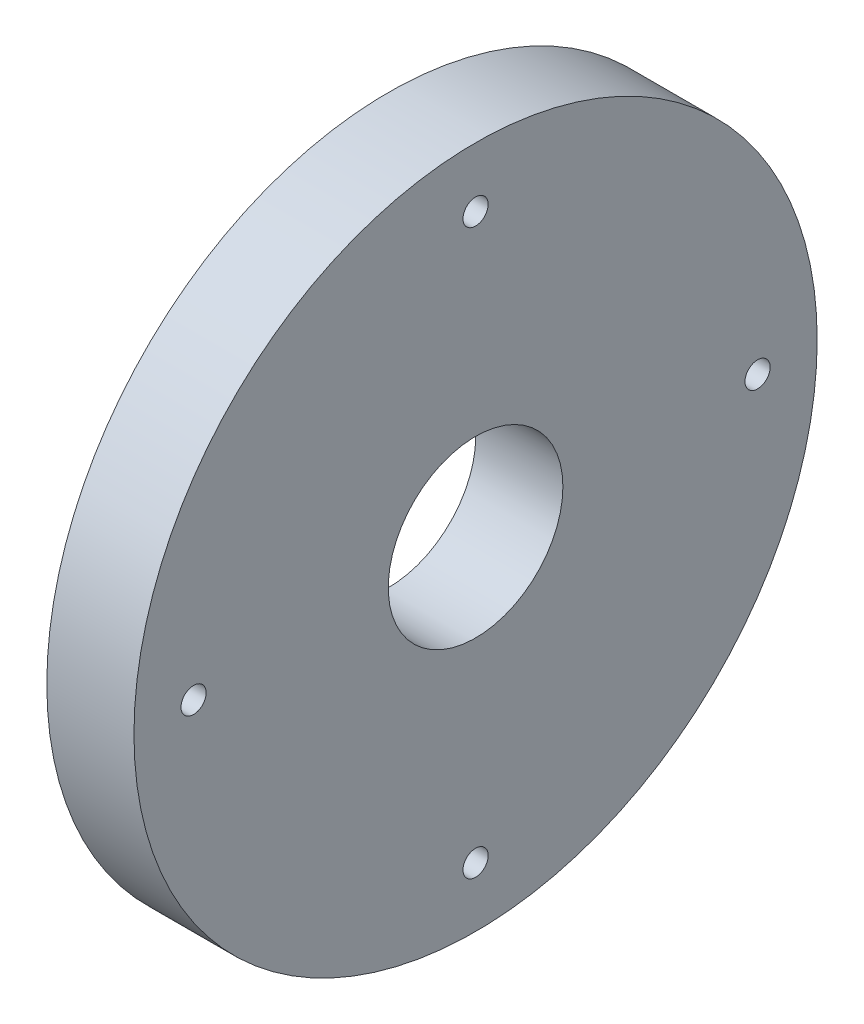
ISO-10303-21;
HEADER;
FILE_DESCRIPTION(('STEP AP214'),'2;1');
FILE_NAME('part.step','',(''),(''),'','','');
FILE_SCHEMA(('AUTOMOTIVE_DESIGN { 1 0 10303 214 1 1 1 1 }'));
ENDSEC;
DATA;
#1=APPLICATION_CONTEXT('core data for automotive mechanical design processes');
#2=APPLICATION_PROTOCOL_DEFINITION('international standard','automotive_design',2000,#1);
#3=PRODUCT_CONTEXT('',#1,'mechanical');
#4=PRODUCT('Part','Part','',(#3));
#5=PRODUCT_RELATED_PRODUCT_CATEGORY('part','',(#4));
#6=PRODUCT_DEFINITION_FORMATION('','',#4);
#7=PRODUCT_DEFINITION_CONTEXT('part definition',#1,'design');
#8=PRODUCT_DEFINITION('design','',#6,#7);
#9=PRODUCT_DEFINITION_SHAPE('','',#8);
#10=(LENGTH_UNIT() NAMED_UNIT(*) SI_UNIT(.MILLI.,.METRE.));
#11=(NAMED_UNIT(*) PLANE_ANGLE_UNIT() SI_UNIT($,.RADIAN.));
#12=(NAMED_UNIT(*) SI_UNIT($,.STERADIAN.) SOLID_ANGLE_UNIT());
#13=UNCERTAINTY_MEASURE_WITH_UNIT(LENGTH_MEASURE(1.E-05),#10,'distance_accuracy_value','');
#14=(GEOMETRIC_REPRESENTATION_CONTEXT(3) GLOBAL_UNCERTAINTY_ASSIGNED_CONTEXT((#13)) GLOBAL_UNIT_ASSIGNED_CONTEXT((#10,
#11,#12)) REPRESENTATION_CONTEXT('',''));
#15=CARTESIAN_POINT('',(0.,0.,0.));
#16=DIRECTION('',(0.,0.,1.));
#17=DIRECTION('',(1.,0.,0.));
#18=AXIS2_PLACEMENT_3D('',#15,#16,#17);
#19=CARTESIAN_POINT('',(-3.175,0.,0.));
#20=DIRECTION('',(1.,0.,0.));
#21=DIRECTION('',(0.,0.,-1.));
#22=AXIS2_PLACEMENT_3D('',#19,#20,#21);
#23=CYLINDRICAL_SURFACE('',#22,24.892);
#24=CARTESIAN_POINT('',(-3.175,0.,0.));
#25=DIRECTION('',(1.,0.,0.));
#26=DIRECTION('',(0.,0.,-1.));
#27=AXIS2_PLACEMENT_3D('',#24,#25,#26);
#28=CIRCLE('',#27,24.892);
#29=CARTESIAN_POINT('',(-3.175,0.,-24.892));
#30=VERTEX_POINT('',#29);
#31=EDGE_CURVE('E10',#30,#30,#28,.T.);
#32=ORIENTED_EDGE('',*,*,#31,.T.);
#33=EDGE_LOOP('',(#32));
#34=FACE_BOUND('',#33,.T.);
#35=CARTESIAN_POINT('',(3.175,0.,0.));
#36=DIRECTION('',(1.,0.,0.));
#37=DIRECTION('',(0.,0.,-1.));
#38=AXIS2_PLACEMENT_3D('',#35,#36,#37);
#39=CIRCLE('',#38,24.892);
#40=CARTESIAN_POINT('',(3.175,0.,-24.892));
#41=VERTEX_POINT('',#40);
#42=EDGE_CURVE('E43',#41,#41,#39,.T.);
#43=ORIENTED_EDGE('',*,*,#42,.F.);
#44=EDGE_LOOP('',(#43));
#45=FACE_BOUND('',#44,.T.);
#46=ADVANCED_FACE('F31',(#34,#45),#23,.T.);
#47=CARTESIAN_POINT('',(-3.175,0.,0.));
#48=DIRECTION('',(1.,0.,0.));
#49=DIRECTION('',(0.,0.,-1.));
#50=AXIS2_PLACEMENT_3D('',#47,#48,#49);
#51=PLANE('',#50);
#52=CARTESIAN_POINT('',(-3.175,0.,20.5468086720289));
#53=DIRECTION('',(1.,0.,0.));
#54=DIRECTION('',(0.,1.,0.));
#55=AXIS2_PLACEMENT_3D('',#52,#53,#54);
#56=CIRCLE('',#55,0.916354932136376);
#57=CARTESIAN_POINT('',(-3.175,0.916354932136305,20.5468086720289));
#58=VERTEX_POINT('',#57);
#59=EDGE_CURVE('E55',#58,#58,#56,.T.);
#60=ORIENTED_EDGE('',*,*,#59,.T.);
#61=EDGE_LOOP('',(#60));
#62=FACE_BOUND('',#61,.T.);
#63=CARTESIAN_POINT('',(-3.175,-20.5468086720289,0.));
#64=DIRECTION('',(1.,0.,0.));
#65=DIRECTION('',(0.,0.,1.));
#66=AXIS2_PLACEMENT_3D('',#63,#64,#65);
#67=CIRCLE('',#66,0.916354932136376);
#68=CARTESIAN_POINT('',(-3.175,-20.5468086720289,0.916354932136376));
#69=VERTEX_POINT('',#68);
#70=EDGE_CURVE('E112',#69,#69,#67,.T.);
#71=ORIENTED_EDGE('',*,*,#70,.T.);
#72=EDGE_LOOP('',(#71));
#73=FACE_BOUND('',#72,.T.);
#74=CARTESIAN_POINT('',(-3.175,2.15216397153508E-13,-20.5468086720289));
#75=DIRECTION('',(1.,0.,0.));
#76=DIRECTION('',(0.,-1.,0.));
#77=AXIS2_PLACEMENT_3D('',#74,#75,#76);
#78=CIRCLE('',#77,0.916354932136376);
#79=CARTESIAN_POINT('',(-3.175,-0.916354932136161,-20.546808672029));
#80=VERTEX_POINT('',#79);
#81=EDGE_CURVE('E68',#80,#80,#78,.T.);
#82=ORIENTED_EDGE('',*,*,#81,.T.);
#83=EDGE_LOOP('',(#82));
#84=FACE_BOUND('',#83,.T.);
#85=CARTESIAN_POINT('',(-3.175,20.5468086720289,0.));
#86=DIRECTION('',(1.,0.,0.));
#87=DIRECTION('',(0.,0.,-1.));
#88=AXIS2_PLACEMENT_3D('',#85,#86,#87);
#89=CIRCLE('',#88,0.916354932136376);
#90=CARTESIAN_POINT('',(-3.175,20.5468086720289,-0.916354932136376));
#91=VERTEX_POINT('',#90);
#92=EDGE_CURVE('E51',#91,#91,#89,.T.);
#93=ORIENTED_EDGE('',*,*,#92,.T.);
#94=EDGE_LOOP('',(#93));
#95=FACE_BOUND('',#94,.T.);
#96=CARTESIAN_POINT('',(-3.175,0.,0.));
#97=DIRECTION('',(1.,0.,0.));
#98=DIRECTION('',(0.,0.,-1.));
#99=AXIS2_PLACEMENT_3D('',#96,#97,#98);
#100=CIRCLE('',#99,6.3627);
#101=CARTESIAN_POINT('',(-3.175,0.,-6.3627));
#102=VERTEX_POINT('',#101);
#103=EDGE_CURVE('E38',#102,#102,#100,.T.);
#104=ORIENTED_EDGE('',*,*,#103,.T.);
#105=EDGE_LOOP('',(#104));
#106=FACE_BOUND('',#105,.T.);
#107=ORIENTED_EDGE('',*,*,#31,.F.);
#108=EDGE_LOOP('',(#107));
#109=FACE_BOUND('',#108,.T.);
#110=ADVANCED_FACE('F78',(#62,#73,#84,#95,#106,#109),#51,.F.);
#111=CARTESIAN_POINT('',(-3.175,0.,0.));
#112=DIRECTION('',(1.,0.,0.));
#113=DIRECTION('',(0.,0.,-1.));
#114=AXIS2_PLACEMENT_3D('',#111,#112,#113);
#115=CYLINDRICAL_SURFACE('',#114,6.3627);
#116=ORIENTED_EDGE('',*,*,#103,.F.);
#117=EDGE_LOOP('',(#116));
#118=FACE_BOUND('',#117,.T.);
#119=CARTESIAN_POINT('',(3.175,0.,0.));
#120=DIRECTION('',(1.,0.,0.));
#121=DIRECTION('',(0.,0.,-1.));
#122=AXIS2_PLACEMENT_3D('',#119,#120,#121);
#123=CIRCLE('',#122,6.3627);
#124=CARTESIAN_POINT('',(3.175,0.,-6.3627));
#125=VERTEX_POINT('',#124);
#126=EDGE_CURVE('E50',#125,#125,#123,.T.);
#127=ORIENTED_EDGE('',*,*,#126,.T.);
#128=EDGE_LOOP('',(#127));
#129=FACE_BOUND('',#128,.T.);
#130=ADVANCED_FACE('F82',(#118,#129),#115,.F.);
#131=CARTESIAN_POINT('',(3.175,0.,0.));
#132=DIRECTION('',(1.,0.,0.));
#133=DIRECTION('',(0.,0.,-1.));
#134=AXIS2_PLACEMENT_3D('',#131,#132,#133);
#135=PLANE('',#134);
#136=CARTESIAN_POINT('',(3.175,0.,20.5468086720289));
#137=DIRECTION('',(1.,0.,0.));
#138=DIRECTION('',(0.,0.,-1.));
#139=AXIS2_PLACEMENT_3D('',#136,#137,#138);
#140=CIRCLE('',#139,0.916354932136376);
#141=CARTESIAN_POINT('',(3.175,0.,19.6304537398926));
#142=VERTEX_POINT('',#141);
#143=EDGE_CURVE('E34',#142,#142,#140,.T.);
#144=ORIENTED_EDGE('',*,*,#143,.F.);
#145=EDGE_LOOP('',(#144));
#146=FACE_BOUND('',#145,.T.);
#147=CARTESIAN_POINT('',(3.175,-20.5468086720289,0.));
#148=DIRECTION('',(1.,0.,0.));
#149=DIRECTION('',(0.,0.,-1.));
#150=AXIS2_PLACEMENT_3D('',#147,#148,#149);
#151=CIRCLE('',#150,0.916354932136376);
#152=CARTESIAN_POINT('',(3.175,-20.5468086720289,-0.916354932136376));
#153=VERTEX_POINT('',#152);
#154=EDGE_CURVE('E54',#153,#153,#151,.T.);
#155=ORIENTED_EDGE('',*,*,#154,.F.);
#156=EDGE_LOOP('',(#155));
#157=FACE_BOUND('',#156,.T.);
#158=CARTESIAN_POINT('',(3.175,2.15216397153508E-13,-20.5468086720289));
#159=DIRECTION('',(1.,0.,0.));
#160=DIRECTION('',(0.,0.,-1.));
#161=AXIS2_PLACEMENT_3D('',#158,#159,#160);
#162=CIRCLE('',#161,0.916354932136376);
#163=CARTESIAN_POINT('',(3.175,2.15216397153508E-13,-21.4631636041653));
#164=VERTEX_POINT('',#163);
#165=EDGE_CURVE('E52',#164,#164,#162,.T.);
#166=ORIENTED_EDGE('',*,*,#165,.F.);
#167=EDGE_LOOP('',(#166));
#168=FACE_BOUND('',#167,.T.);
#169=CARTESIAN_POINT('',(3.175,20.5468086720289,0.));
#170=DIRECTION('',(1.,0.,0.));
#171=DIRECTION('',(0.,0.,-1.));
#172=AXIS2_PLACEMENT_3D('',#169,#170,#171);
#173=CIRCLE('',#172,0.916354932136376);
#174=CARTESIAN_POINT('',(3.175,20.5468086720289,-0.916354932136376));
#175=VERTEX_POINT('',#174);
#176=EDGE_CURVE('E47',#175,#175,#173,.T.);
#177=ORIENTED_EDGE('',*,*,#176,.F.);
#178=EDGE_LOOP('',(#177));
#179=FACE_BOUND('',#178,.T.);
#180=ORIENTED_EDGE('',*,*,#42,.T.);
#181=EDGE_LOOP('',(#180));
#182=FACE_BOUND('',#181,.T.);
#183=ORIENTED_EDGE('',*,*,#126,.F.);
#184=EDGE_LOOP('',(#183));
#185=FACE_BOUND('',#184,.T.);
#186=ADVANCED_FACE('F74',(#146,#157,#168,#179,#182,#185),#135,.T.);
#187=CARTESIAN_POINT('',(-3.175,20.5468086720289,0.));
#188=DIRECTION('',(1.,0.,0.));
#189=DIRECTION('',(0.,0.,-1.));
#190=AXIS2_PLACEMENT_3D('',#187,#188,#189);
#191=CYLINDRICAL_SURFACE('',#190,0.916354932136376);
#192=ORIENTED_EDGE('',*,*,#176,.T.);
#193=EDGE_LOOP('',(#192));
#194=FACE_BOUND('',#193,.T.);
#195=ORIENTED_EDGE('',*,*,#92,.F.);
#196=EDGE_LOOP('',(#195));
#197=FACE_BOUND('',#196,.T.);
#198=ADVANCED_FACE('F94',(#194,#197),#191,.F.);
#199=CARTESIAN_POINT('',(-3.175,2.15216397153508E-13,-20.5468086720289));
#200=DIRECTION('',(1.,0.,0.));
#201=DIRECTION('',(0.,0.,-1.));
#202=AXIS2_PLACEMENT_3D('',#199,#200,#201);
#203=CYLINDRICAL_SURFACE('',#202,0.916354932136376);
#204=ORIENTED_EDGE('',*,*,#165,.T.);
#205=EDGE_LOOP('',(#204));
#206=FACE_BOUND('',#205,.T.);
#207=ORIENTED_EDGE('',*,*,#81,.F.);
#208=EDGE_LOOP('',(#207));
#209=FACE_BOUND('',#208,.T.);
#210=ADVANCED_FACE('F98',(#206,#209),#203,.F.);
#211=CARTESIAN_POINT('',(-3.175,-20.5468086720289,0.));
#212=DIRECTION('',(1.,0.,0.));
#213=DIRECTION('',(0.,0.,-1.));
#214=AXIS2_PLACEMENT_3D('',#211,#212,#213);
#215=CYLINDRICAL_SURFACE('',#214,0.916354932136376);
#216=ORIENTED_EDGE('',*,*,#154,.T.);
#217=EDGE_LOOP('',(#216));
#218=FACE_BOUND('',#217,.T.);
#219=ORIENTED_EDGE('',*,*,#70,.F.);
#220=EDGE_LOOP('',(#219));
#221=FACE_BOUND('',#220,.T.);
#222=ADVANCED_FACE('F102',(#218,#221),#215,.F.);
#223=CARTESIAN_POINT('',(-3.175,0.,20.5468086720289));
#224=DIRECTION('',(1.,0.,0.));
#225=DIRECTION('',(0.,0.,-1.));
#226=AXIS2_PLACEMENT_3D('',#223,#224,#225);
#227=CYLINDRICAL_SURFACE('',#226,0.916354932136376);
#228=ORIENTED_EDGE('',*,*,#143,.T.);
#229=EDGE_LOOP('',(#228));
#230=FACE_BOUND('',#229,.T.);
#231=ORIENTED_EDGE('',*,*,#59,.F.);
#232=EDGE_LOOP('',(#231));
#233=FACE_BOUND('',#232,.T.);
#234=ADVANCED_FACE('F106',(#230,#233),#227,.F.);
#235=CLOSED_SHELL('',(#46,#110,#130,#186,#198,#210,#222,#234));
#236=MANIFOLD_SOLID_BREP('B2',#235);
#237=ADVANCED_BREP_SHAPE_REPRESENTATION('',(#18,#236),#14);
#238=SHAPE_DEFINITION_REPRESENTATION(#9,#237);
ENDSEC;
END-ISO-10303-21;
